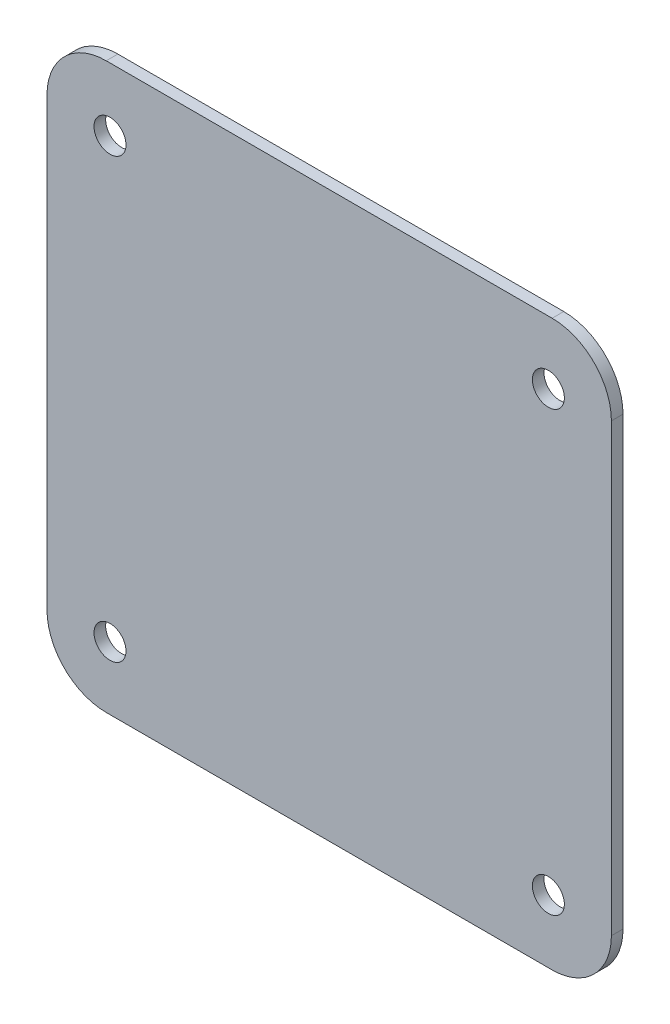
ISO-10303-21;
HEADER;
FILE_DESCRIPTION(('STEP AP214'),'2;1');
FILE_NAME('part.step','',(''),(''),'','','');
FILE_SCHEMA(('AUTOMOTIVE_DESIGN { 1 0 10303 214 1 1 1 1 }'));
ENDSEC;
DATA;
#1=APPLICATION_CONTEXT('core data for automotive mechanical design processes');
#2=APPLICATION_PROTOCOL_DEFINITION('international standard','automotive_design',2000,#1);
#3=PRODUCT_CONTEXT('',#1,'mechanical');
#4=PRODUCT('Part','Part','',(#3));
#5=PRODUCT_RELATED_PRODUCT_CATEGORY('part','',(#4));
#6=PRODUCT_DEFINITION_FORMATION('','',#4);
#7=PRODUCT_DEFINITION_CONTEXT('part definition',#1,'design');
#8=PRODUCT_DEFINITION('design','',#6,#7);
#9=PRODUCT_DEFINITION_SHAPE('','',#8);
#10=(LENGTH_UNIT() NAMED_UNIT(*) SI_UNIT(.MILLI.,.METRE.));
#11=(NAMED_UNIT(*) PLANE_ANGLE_UNIT() SI_UNIT($,.RADIAN.));
#12=(NAMED_UNIT(*) SI_UNIT($,.STERADIAN.) SOLID_ANGLE_UNIT());
#13=UNCERTAINTY_MEASURE_WITH_UNIT(LENGTH_MEASURE(1.E-05),#10,'distance_accuracy_value','');
#14=(GEOMETRIC_REPRESENTATION_CONTEXT(3) GLOBAL_UNCERTAINTY_ASSIGNED_CONTEXT((#13)) GLOBAL_UNIT_ASSIGNED_CONTEXT((#10,
#11,#12)) REPRESENTATION_CONTEXT('',''));
#15=CARTESIAN_POINT('',(0.,0.,0.));
#16=DIRECTION('',(0.,0.,1.));
#17=DIRECTION('',(1.,0.,0.));
#18=AXIS2_PLACEMENT_3D('',#15,#16,#17);
#19=CARTESIAN_POINT('',(0.,0.,1.57));
#20=DIRECTION('',(0.,0.,1.));
#21=DIRECTION('',(1.,0.,0.));
#22=AXIS2_PLACEMENT_3D('',#19,#20,#21);
#23=PLANE('',#22);
#24=CARTESIAN_POINT('',(-29.591,29.591,1.57));
#25=DIRECTION('',(0.,0.,1.));
#26=DIRECTION('',(1.,0.,0.));
#27=AXIS2_PLACEMENT_3D('',#24,#25,#26);
#28=CIRCLE('',#27,2.159);
#29=CARTESIAN_POINT('',(-27.432,29.591,1.57));
#30=VERTEX_POINT('',#29);
#31=EDGE_CURVE('E147',#30,#30,#28,.F.);
#32=ORIENTED_EDGE('',*,*,#31,.T.);
#33=EDGE_LOOP('',(#32));
#34=FACE_BOUND('',#33,.T.);
#35=CARTESIAN_POINT('',(29.591,-29.5909999999999,1.57));
#36=DIRECTION('',(0.,0.,1.));
#37=DIRECTION('',(1.,0.,0.));
#38=AXIS2_PLACEMENT_3D('',#35,#36,#37);
#39=CIRCLE('',#38,2.159);
#40=CARTESIAN_POINT('',(31.75,-29.5909999999999,1.57));
#41=VERTEX_POINT('',#40);
#42=EDGE_CURVE('E151',#41,#41,#39,.F.);
#43=ORIENTED_EDGE('',*,*,#42,.T.);
#44=EDGE_LOOP('',(#43));
#45=FACE_BOUND('',#44,.T.);
#46=CARTESIAN_POINT('',(29.591,29.591,1.57));
#47=DIRECTION('',(0.,0.,1.));
#48=DIRECTION('',(1.,0.,0.));
#49=AXIS2_PLACEMENT_3D('',#46,#47,#48);
#50=CIRCLE('',#49,2.159);
#51=CARTESIAN_POINT('',(31.75,29.591,1.57));
#52=VERTEX_POINT('',#51);
#53=EDGE_CURVE('E137',#52,#52,#50,.T.);
#54=ORIENTED_EDGE('',*,*,#53,.F.);
#55=EDGE_LOOP('',(#54));
#56=FACE_BOUND('',#55,.T.);
#57=DIRECTION('',(0.,-1.,0.));
#58=VECTOR('',#57,1.);
#59=CARTESIAN_POINT('',(-38.1,38.1,1.57));
#60=LINE('',#59,#58);
#61=CARTESIAN_POINT('',(-38.1,30.1,1.57));
#62=VERTEX_POINT('',#61);
#63=CARTESIAN_POINT('',(-38.1,-30.1,1.57));
#64=VERTEX_POINT('',#63);
#65=EDGE_CURVE('E143',#62,#64,#60,.T.);
#66=ORIENTED_EDGE('',*,*,#65,.T.);
#67=CARTESIAN_POINT('',(-30.1,-30.1,1.57));
#68=DIRECTION('',(0.,0.,1.));
#69=DIRECTION('',(1.,0.,0.));
#70=AXIS2_PLACEMENT_3D('',#67,#68,#69);
#71=CIRCLE('',#70,8.);
#72=CARTESIAN_POINT('',(-30.1,-38.1,1.57));
#73=VERTEX_POINT('',#72);
#74=EDGE_CURVE('E173',#64,#73,#71,.T.);
#75=ORIENTED_EDGE('',*,*,#74,.T.);
#76=DIRECTION('',(1.,0.,0.));
#77=VECTOR('',#76,1.);
#78=CARTESIAN_POINT('',(-38.1,-38.1,1.57));
#79=LINE('',#78,#77);
#80=CARTESIAN_POINT('',(30.1,-38.1,1.57));
#81=VERTEX_POINT('',#80);
#82=EDGE_CURVE('E125',#73,#81,#79,.T.);
#83=ORIENTED_EDGE('',*,*,#82,.T.);
#84=CARTESIAN_POINT('',(30.1,-30.1,1.57));
#85=DIRECTION('',(0.,0.,1.));
#86=DIRECTION('',(1.,0.,0.));
#87=AXIS2_PLACEMENT_3D('',#84,#85,#86);
#88=CIRCLE('',#87,8.);
#89=CARTESIAN_POINT('',(38.1,-30.1,1.57));
#90=VERTEX_POINT('',#89);
#91=EDGE_CURVE('E171',#81,#90,#88,.T.);
#92=ORIENTED_EDGE('',*,*,#91,.T.);
#93=DIRECTION('',(0.,-1.,0.));
#94=VECTOR('',#93,1.);
#95=CARTESIAN_POINT('',(38.1,38.1,1.57));
#96=LINE('',#95,#94);
#97=CARTESIAN_POINT('',(38.1,30.1,1.57));
#98=VERTEX_POINT('',#97);
#99=EDGE_CURVE('E185',#98,#90,#96,.T.);
#100=ORIENTED_EDGE('',*,*,#99,.F.);
#101=CARTESIAN_POINT('',(30.1,30.1,1.57));
#102=DIRECTION('',(0.,0.,1.));
#103=DIRECTION('',(1.,0.,0.));
#104=AXIS2_PLACEMENT_3D('',#101,#102,#103);
#105=CIRCLE('',#104,8.);
#106=CARTESIAN_POINT('',(30.1,38.1,1.57));
#107=VERTEX_POINT('',#106);
#108=EDGE_CURVE('E54',#98,#107,#105,.T.);
#109=ORIENTED_EDGE('',*,*,#108,.T.);
#110=DIRECTION('',(1.,0.,0.));
#111=VECTOR('',#110,1.);
#112=CARTESIAN_POINT('',(-38.1,38.1,1.57));
#113=LINE('',#112,#111);
#114=CARTESIAN_POINT('',(-30.1,38.1,1.57));
#115=VERTEX_POINT('',#114);
#116=EDGE_CURVE('E159',#115,#107,#113,.T.);
#117=ORIENTED_EDGE('',*,*,#116,.F.);
#118=CARTESIAN_POINT('',(-30.1,30.1,1.57));
#119=DIRECTION('',(0.,0.,1.));
#120=DIRECTION('',(1.,0.,0.));
#121=AXIS2_PLACEMENT_3D('',#118,#119,#120);
#122=CIRCLE('',#121,8.);
#123=EDGE_CURVE('E168',#115,#62,#122,.T.);
#124=ORIENTED_EDGE('',*,*,#123,.T.);
#125=EDGE_LOOP('',(#66,#75,#83,#92,#100,#109,#117,#124));
#126=FACE_BOUND('',#125,.T.);
#127=CARTESIAN_POINT('',(-29.591,-29.591,1.57));
#128=DIRECTION('',(0.,0.,1.));
#129=DIRECTION('',(1.,0.,0.));
#130=AXIS2_PLACEMENT_3D('',#127,#128,#129);
#131=CIRCLE('',#130,2.159);
#132=CARTESIAN_POINT('',(-27.432,-29.591,1.57));
#133=VERTEX_POINT('',#132);
#134=EDGE_CURVE('E155',#133,#133,#131,.T.);
#135=ORIENTED_EDGE('',*,*,#134,.F.);
#136=EDGE_LOOP('',(#135));
#137=FACE_BOUND('',#136,.T.);
#138=ADVANCED_FACE('F39',(#34,#45,#56,#126,#137),#23,.T.);
#139=CARTESIAN_POINT('',(0.,0.,0.));
#140=DIRECTION('',(0.,0.,1.));
#141=DIRECTION('',(1.,0.,0.));
#142=AXIS2_PLACEMENT_3D('',#139,#140,#141);
#143=PLANE('',#142);
#144=CARTESIAN_POINT('',(-29.591,29.591,0.));
#145=DIRECTION('',(0.,0.,1.));
#146=DIRECTION('',(1.,0.,0.));
#147=AXIS2_PLACEMENT_3D('',#144,#145,#146);
#148=CIRCLE('',#147,2.159);
#149=CARTESIAN_POINT('',(-27.432,29.591,0.));
#150=VERTEX_POINT('',#149);
#151=EDGE_CURVE('E156',#150,#150,#148,.F.);
#152=ORIENTED_EDGE('',*,*,#151,.F.);
#153=EDGE_LOOP('',(#152));
#154=FACE_BOUND('',#153,.T.);
#155=DIRECTION('',(1.,0.,0.));
#156=VECTOR('',#155,1.);
#157=CARTESIAN_POINT('',(-38.1,-38.1,0.));
#158=LINE('',#157,#156);
#159=CARTESIAN_POINT('',(-30.1,-38.1,0.));
#160=VERTEX_POINT('',#159);
#161=CARTESIAN_POINT('',(30.1,-38.1,0.));
#162=VERTEX_POINT('',#161);
#163=EDGE_CURVE('E122',#160,#162,#158,.T.);
#164=ORIENTED_EDGE('',*,*,#163,.F.);
#165=CARTESIAN_POINT('',(-30.1,-30.1,0.));
#166=DIRECTION('',(0.,0.,1.));
#167=DIRECTION('',(1.,0.,0.));
#168=AXIS2_PLACEMENT_3D('',#165,#166,#167);
#169=CIRCLE('',#168,8.);
#170=CARTESIAN_POINT('',(-38.1,-30.1,0.));
#171=VERTEX_POINT('',#170);
#172=EDGE_CURVE('E105',#160,#171,#169,.F.);
#173=ORIENTED_EDGE('',*,*,#172,.T.);
#174=DIRECTION('',(0.,-1.,0.));
#175=VECTOR('',#174,1.);
#176=CARTESIAN_POINT('',(-38.1,38.1,0.));
#177=LINE('',#176,#175);
#178=CARTESIAN_POINT('',(-38.1,30.1,0.));
#179=VERTEX_POINT('',#178);
#180=EDGE_CURVE('E133',#179,#171,#177,.T.);
#181=ORIENTED_EDGE('',*,*,#180,.F.);
#182=CARTESIAN_POINT('',(-30.1,30.1,0.));
#183=DIRECTION('',(0.,0.,1.));
#184=DIRECTION('',(1.,0.,0.));
#185=AXIS2_PLACEMENT_3D('',#182,#183,#184);
#186=CIRCLE('',#185,8.);
#187=CARTESIAN_POINT('',(-30.1,38.1,0.));
#188=VERTEX_POINT('',#187);
#189=EDGE_CURVE('E126',#179,#188,#186,.F.);
#190=ORIENTED_EDGE('',*,*,#189,.T.);
#191=DIRECTION('',(1.,0.,0.));
#192=VECTOR('',#191,1.);
#193=CARTESIAN_POINT('',(-38.1,38.1,0.));
#194=LINE('',#193,#192);
#195=CARTESIAN_POINT('',(30.1,38.1,0.));
#196=VERTEX_POINT('',#195);
#197=EDGE_CURVE('E135',#188,#196,#194,.T.);
#198=ORIENTED_EDGE('',*,*,#197,.T.);
#199=CARTESIAN_POINT('',(30.1,30.1,0.));
#200=DIRECTION('',(0.,0.,1.));
#201=DIRECTION('',(1.,0.,0.));
#202=AXIS2_PLACEMENT_3D('',#199,#200,#201);
#203=CIRCLE('',#202,8.);
#204=CARTESIAN_POINT('',(38.1,30.1,0.));
#205=VERTEX_POINT('',#204);
#206=EDGE_CURVE('E162',#196,#205,#203,.F.);
#207=ORIENTED_EDGE('',*,*,#206,.T.);
#208=DIRECTION('',(0.,-1.,0.));
#209=VECTOR('',#208,1.);
#210=CARTESIAN_POINT('',(38.1,38.1,0.));
#211=LINE('',#210,#209);
#212=CARTESIAN_POINT('',(38.1,-30.1,0.));
#213=VERTEX_POINT('',#212);
#214=EDGE_CURVE('E132',#205,#213,#211,.T.);
#215=ORIENTED_EDGE('',*,*,#214,.T.);
#216=CARTESIAN_POINT('',(30.1,-30.1,0.));
#217=DIRECTION('',(0.,0.,1.));
#218=DIRECTION('',(1.,0.,0.));
#219=AXIS2_PLACEMENT_3D('',#216,#217,#218);
#220=CIRCLE('',#219,8.);
#221=EDGE_CURVE('E116',#213,#162,#220,.F.);
#222=ORIENTED_EDGE('',*,*,#221,.T.);
#223=EDGE_LOOP('',(#164,#173,#181,#190,#198,#207,#215,#222));
#224=FACE_BOUND('',#223,.T.);
#225=CARTESIAN_POINT('',(29.591,29.591,0.));
#226=DIRECTION('',(0.,0.,1.));
#227=DIRECTION('',(1.,0.,0.));
#228=AXIS2_PLACEMENT_3D('',#225,#226,#227);
#229=CIRCLE('',#228,2.159);
#230=CARTESIAN_POINT('',(31.75,29.591,0.));
#231=VERTEX_POINT('',#230);
#232=EDGE_CURVE('E144',#231,#231,#229,.T.);
#233=ORIENTED_EDGE('',*,*,#232,.T.);
#234=EDGE_LOOP('',(#233));
#235=FACE_BOUND('',#234,.T.);
#236=CARTESIAN_POINT('',(29.591,-29.5909999999999,0.));
#237=DIRECTION('',(0.,0.,1.));
#238=DIRECTION('',(1.,0.,0.));
#239=AXIS2_PLACEMENT_3D('',#236,#237,#238);
#240=CIRCLE('',#239,2.159);
#241=CARTESIAN_POINT('',(31.75,-29.5909999999999,0.));
#242=VERTEX_POINT('',#241);
#243=EDGE_CURVE('E148',#242,#242,#240,.F.);
#244=ORIENTED_EDGE('',*,*,#243,.F.);
#245=EDGE_LOOP('',(#244));
#246=FACE_BOUND('',#245,.T.);
#247=CARTESIAN_POINT('',(-29.591,-29.591,0.));
#248=DIRECTION('',(0.,0.,1.));
#249=DIRECTION('',(1.,0.,0.));
#250=AXIS2_PLACEMENT_3D('',#247,#248,#249);
#251=CIRCLE('',#250,2.159);
#252=CARTESIAN_POINT('',(-27.432,-29.591,0.));
#253=VERTEX_POINT('',#252);
#254=EDGE_CURVE('E152',#253,#253,#251,.T.);
#255=ORIENTED_EDGE('',*,*,#254,.T.);
#256=EDGE_LOOP('',(#255));
#257=FACE_BOUND('',#256,.T.);
#258=ADVANCED_FACE('F129',(#154,#224,#235,#246,#257),#143,.F.);
#259=CARTESIAN_POINT('',(-38.1,38.1,1.57));
#260=DIRECTION('',(1.,0.,0.));
#261=DIRECTION('',(0.,1.,0.));
#262=AXIS2_PLACEMENT_3D('',#259,#260,#261);
#263=PLANE('',#262);
#264=ORIENTED_EDGE('',*,*,#180,.T.);
#265=DIRECTION('',(0.,0.,-1.));
#266=VECTOR('',#265,1.);
#267=CARTESIAN_POINT('',(-38.1,-30.1,1.57));
#268=LINE('',#267,#266);
#269=EDGE_CURVE('E110',#171,#64,#268,.F.);
#270=ORIENTED_EDGE('',*,*,#269,.T.);
#271=ORIENTED_EDGE('',*,*,#65,.F.);
#272=DIRECTION('',(0.,0.,-1.));
#273=VECTOR('',#272,1.);
#274=CARTESIAN_POINT('',(-38.1,30.1,0.));
#275=LINE('',#274,#273);
#276=EDGE_CURVE('E115',#62,#179,#275,.T.);
#277=ORIENTED_EDGE('',*,*,#276,.T.);
#278=EDGE_LOOP('',(#264,#270,#271,#277));
#279=FACE_BOUND('',#278,.T.);
#280=ADVANCED_FACE('F219',(#279),#263,.F.);
#281=CARTESIAN_POINT('',(-38.1,-38.1,1.57));
#282=DIRECTION('',(0.,1.,0.));
#283=DIRECTION('',(0.,0.,1.));
#284=AXIS2_PLACEMENT_3D('',#281,#282,#283);
#285=PLANE('',#284);
#286=ORIENTED_EDGE('',*,*,#82,.F.);
#287=DIRECTION('',(0.,0.,-1.));
#288=VECTOR('',#287,1.);
#289=CARTESIAN_POINT('',(-30.1,-38.1,1.57));
#290=LINE('',#289,#288);
#291=EDGE_CURVE('E109',#73,#160,#290,.T.);
#292=ORIENTED_EDGE('',*,*,#291,.T.);
#293=ORIENTED_EDGE('',*,*,#163,.T.);
#294=DIRECTION('',(0.,0.,-1.));
#295=VECTOR('',#294,1.);
#296=CARTESIAN_POINT('',(30.1,-38.1,1.57));
#297=LINE('',#296,#295);
#298=EDGE_CURVE('E127',#162,#81,#297,.F.);
#299=ORIENTED_EDGE('',*,*,#298,.T.);
#300=EDGE_LOOP('',(#286,#292,#293,#299));
#301=FACE_BOUND('',#300,.T.);
#302=ADVANCED_FACE('F121',(#301),#285,.F.);
#303=CARTESIAN_POINT('',(38.1,38.1,1.57));
#304=DIRECTION('',(1.,0.,0.));
#305=DIRECTION('',(0.,1.,0.));
#306=AXIS2_PLACEMENT_3D('',#303,#304,#305);
#307=PLANE('',#306);
#308=ORIENTED_EDGE('',*,*,#99,.T.);
#309=DIRECTION('',(0.,0.,-1.));
#310=VECTOR('',#309,1.);
#311=CARTESIAN_POINT('',(38.1,-30.1,0.));
#312=LINE('',#311,#310);
#313=EDGE_CURVE('E177',#90,#213,#312,.T.);
#314=ORIENTED_EDGE('',*,*,#313,.T.);
#315=ORIENTED_EDGE('',*,*,#214,.F.);
#316=DIRECTION('',(0.,0.,-1.));
#317=VECTOR('',#316,1.);
#318=CARTESIAN_POINT('',(38.1,30.1,1.57));
#319=LINE('',#318,#317);
#320=EDGE_CURVE('E175',#205,#98,#319,.F.);
#321=ORIENTED_EDGE('',*,*,#320,.T.);
#322=EDGE_LOOP('',(#308,#314,#315,#321));
#323=FACE_BOUND('',#322,.T.);
#324=ADVANCED_FACE('F183',(#323),#307,.T.);
#325=CARTESIAN_POINT('',(-38.1,38.1,1.57));
#326=DIRECTION('',(0.,1.,0.));
#327=DIRECTION('',(-1.,0.,0.));
#328=AXIS2_PLACEMENT_3D('',#325,#326,#327);
#329=PLANE('',#328);
#330=ORIENTED_EDGE('',*,*,#116,.T.);
#331=DIRECTION('',(0.,0.,-1.));
#332=VECTOR('',#331,1.);
#333=CARTESIAN_POINT('',(30.1,38.1,1.57));
#334=LINE('',#333,#332);
#335=EDGE_CURVE('E11',#107,#196,#334,.T.);
#336=ORIENTED_EDGE('',*,*,#335,.T.);
#337=ORIENTED_EDGE('',*,*,#197,.F.);
#338=DIRECTION('',(0.,0.,-1.));
#339=VECTOR('',#338,1.);
#340=CARTESIAN_POINT('',(-30.1,38.1,1.57));
#341=LINE('',#340,#339);
#342=EDGE_CURVE('E47',#188,#115,#341,.F.);
#343=ORIENTED_EDGE('',*,*,#342,.T.);
#344=EDGE_LOOP('',(#330,#336,#337,#343));
#345=FACE_BOUND('',#344,.T.);
#346=ADVANCED_FACE('F191',(#345),#329,.T.);
#347=CARTESIAN_POINT('',(29.591,29.591,16.));
#348=DIRECTION('',(0.,0.,-1.));
#349=DIRECTION('',(-1.,0.,0.));
#350=AXIS2_PLACEMENT_3D('',#347,#348,#349);
#351=CYLINDRICAL_SURFACE('',#350,2.159);
#352=ORIENTED_EDGE('',*,*,#53,.T.);
#353=EDGE_LOOP('',(#352));
#354=FACE_BOUND('',#353,.T.);
#355=ORIENTED_EDGE('',*,*,#232,.F.);
#356=EDGE_LOOP('',(#355));
#357=FACE_BOUND('',#356,.T.);
#358=ADVANCED_FACE('F213',(#354,#357),#351,.F.);
#359=CARTESIAN_POINT('',(29.591,-29.5909999999999,24.));
#360=DIRECTION('',(0.,0.,-1.));
#361=DIRECTION('',(-1.,0.,0.));
#362=AXIS2_PLACEMENT_3D('',#359,#360,#361);
#363=CYLINDRICAL_SURFACE('',#362,2.159);
#364=ORIENTED_EDGE('',*,*,#42,.F.);
#365=EDGE_LOOP('',(#364));
#366=FACE_BOUND('',#365,.T.);
#367=ORIENTED_EDGE('',*,*,#243,.T.);
#368=EDGE_LOOP('',(#367));
#369=FACE_BOUND('',#368,.T.);
#370=ADVANCED_FACE('F209',(#366,#369),#363,.F.);
#371=CARTESIAN_POINT('',(-29.591,-29.591,24.));
#372=DIRECTION('',(0.,0.,-1.));
#373=DIRECTION('',(-1.,0.,0.));
#374=AXIS2_PLACEMENT_3D('',#371,#372,#373);
#375=CYLINDRICAL_SURFACE('',#374,2.159);
#376=ORIENTED_EDGE('',*,*,#134,.T.);
#377=EDGE_LOOP('',(#376));
#378=FACE_BOUND('',#377,.T.);
#379=ORIENTED_EDGE('',*,*,#254,.F.);
#380=EDGE_LOOP('',(#379));
#381=FACE_BOUND('',#380,.T.);
#382=ADVANCED_FACE('F212',(#378,#381),#375,.F.);
#383=CARTESIAN_POINT('',(-29.591,29.591,24.));
#384=DIRECTION('',(0.,0.,-1.));
#385=DIRECTION('',(-1.,0.,0.));
#386=AXIS2_PLACEMENT_3D('',#383,#384,#385);
#387=CYLINDRICAL_SURFACE('',#386,2.159);
#388=ORIENTED_EDGE('',*,*,#31,.F.);
#389=EDGE_LOOP('',(#388));
#390=FACE_BOUND('',#389,.T.);
#391=ORIENTED_EDGE('',*,*,#151,.T.);
#392=EDGE_LOOP('',(#391));
#393=FACE_BOUND('',#392,.T.);
#394=ADVANCED_FACE('F225',(#390,#393),#387,.F.);
#395=CARTESIAN_POINT('',(-30.1,-30.1,1.57));
#396=DIRECTION('',(0.,0.,-1.));
#397=DIRECTION('',(-1.,0.,0.));
#398=AXIS2_PLACEMENT_3D('',#395,#396,#397);
#399=CYLINDRICAL_SURFACE('',#398,8.);
#400=ORIENTED_EDGE('',*,*,#74,.F.);
#401=ORIENTED_EDGE('',*,*,#269,.F.);
#402=ORIENTED_EDGE('',*,*,#172,.F.);
#403=ORIENTED_EDGE('',*,*,#291,.F.);
#404=EDGE_LOOP('',(#400,#401,#402,#403));
#405=FACE_BOUND('',#404,.T.);
#406=ADVANCED_FACE('F108',(#405),#399,.T.);
#407=CARTESIAN_POINT('',(30.1,-30.1,1.57));
#408=DIRECTION('',(0.,0.,1.));
#409=DIRECTION('',(1.,0.,0.));
#410=AXIS2_PLACEMENT_3D('',#407,#408,#409);
#411=CYLINDRICAL_SURFACE('',#410,8.);
#412=ORIENTED_EDGE('',*,*,#91,.F.);
#413=ORIENTED_EDGE('',*,*,#298,.F.);
#414=ORIENTED_EDGE('',*,*,#221,.F.);
#415=ORIENTED_EDGE('',*,*,#313,.F.);
#416=EDGE_LOOP('',(#412,#413,#414,#415));
#417=FACE_BOUND('',#416,.T.);
#418=ADVANCED_FACE('F251',(#417),#411,.T.);
#419=CARTESIAN_POINT('',(30.1,30.1,1.57));
#420=DIRECTION('',(0.,0.,-1.));
#421=DIRECTION('',(-1.,0.,0.));
#422=AXIS2_PLACEMENT_3D('',#419,#420,#421);
#423=CYLINDRICAL_SURFACE('',#422,8.);
#424=ORIENTED_EDGE('',*,*,#108,.F.);
#425=ORIENTED_EDGE('',*,*,#320,.F.);
#426=ORIENTED_EDGE('',*,*,#206,.F.);
#427=ORIENTED_EDGE('',*,*,#335,.F.);
#428=EDGE_LOOP('',(#424,#425,#426,#427));
#429=FACE_BOUND('',#428,.T.);
#430=ADVANCED_FACE('F190',(#429),#423,.T.);
#431=CARTESIAN_POINT('',(-30.1,30.1,1.57));
#432=DIRECTION('',(0.,0.,1.));
#433=DIRECTION('',(1.,0.,0.));
#434=AXIS2_PLACEMENT_3D('',#431,#432,#433);
#435=CYLINDRICAL_SURFACE('',#434,8.);
#436=ORIENTED_EDGE('',*,*,#123,.F.);
#437=ORIENTED_EDGE('',*,*,#342,.F.);
#438=ORIENTED_EDGE('',*,*,#189,.F.);
#439=ORIENTED_EDGE('',*,*,#276,.F.);
#440=EDGE_LOOP('',(#436,#437,#438,#439));
#441=FACE_BOUND('',#440,.T.);
#442=ADVANCED_FACE('F41',(#441),#435,.T.);
#443=CLOSED_SHELL('',(#138,#258,#280,#302,#324,#346,#358,#370,#382,#394,#406,#418,#430,#442));
#444=MANIFOLD_SOLID_BREP('B2',#443);
#445=ADVANCED_BREP_SHAPE_REPRESENTATION('',(#18,#444),#14);
#446=SHAPE_DEFINITION_REPRESENTATION(#9,#445);
ENDSEC;
END-ISO-10303-21;
